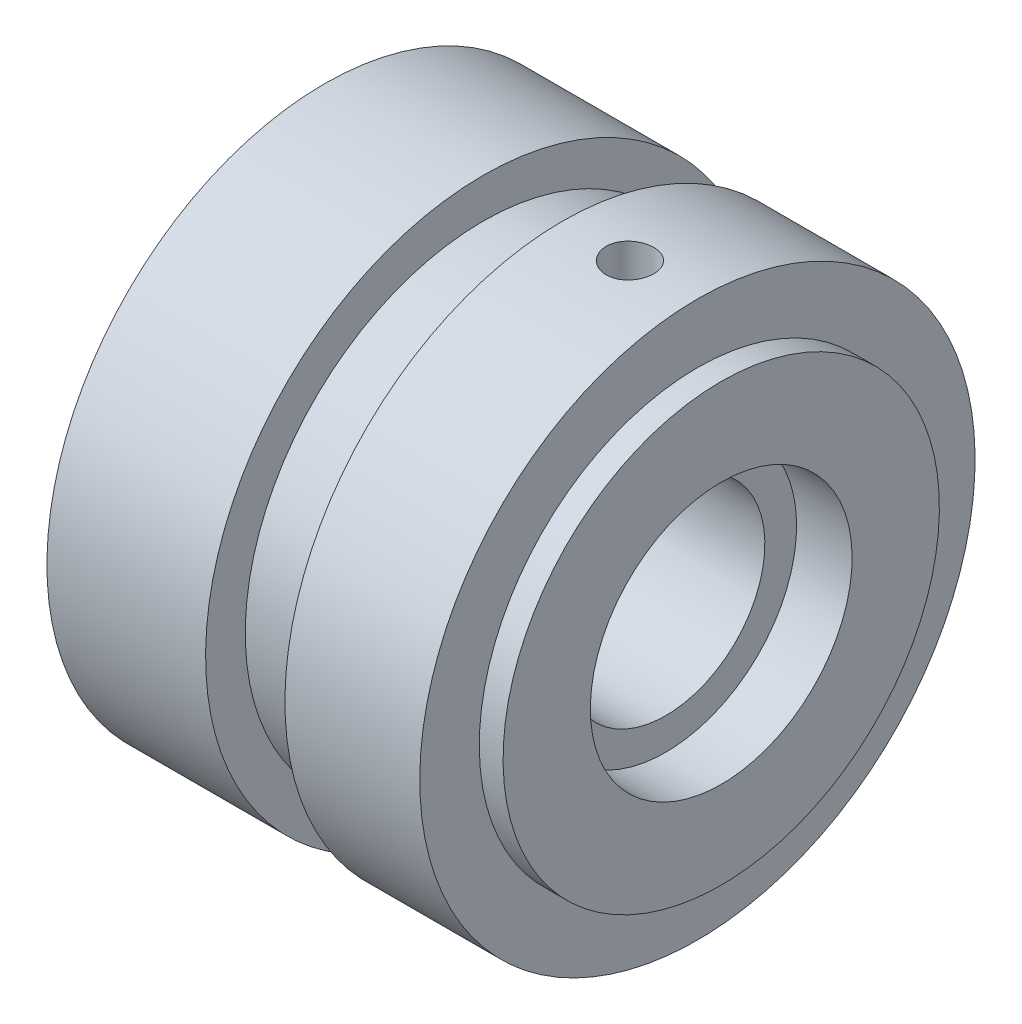
ISO-10303-21;
HEADER;
FILE_DESCRIPTION(('STEP AP214'),'2;1');
FILE_NAME('part.step','',(''),(''),'','','');
FILE_SCHEMA(('AUTOMOTIVE_DESIGN { 1 0 10303 214 1 1 1 1 }'));
ENDSEC;
DATA;
#1=APPLICATION_CONTEXT('core data for automotive mechanical design processes');
#2=APPLICATION_PROTOCOL_DEFINITION('international standard','automotive_design',2000,#1);
#3=PRODUCT_CONTEXT('',#1,'mechanical');
#4=PRODUCT('Part','Part','',(#3));
#5=PRODUCT_RELATED_PRODUCT_CATEGORY('part','',(#4));
#6=PRODUCT_DEFINITION_FORMATION('','',#4);
#7=PRODUCT_DEFINITION_CONTEXT('part definition',#1,'design');
#8=PRODUCT_DEFINITION('design','',#6,#7);
#9=PRODUCT_DEFINITION_SHAPE('','',#8);
#10=(LENGTH_UNIT() NAMED_UNIT(*) SI_UNIT(.MILLI.,.METRE.));
#11=(NAMED_UNIT(*) PLANE_ANGLE_UNIT() SI_UNIT($,.RADIAN.));
#12=(NAMED_UNIT(*) SI_UNIT($,.STERADIAN.) SOLID_ANGLE_UNIT());
#13=UNCERTAINTY_MEASURE_WITH_UNIT(LENGTH_MEASURE(1.E-05),#10,'distance_accuracy_value','');
#14=(GEOMETRIC_REPRESENTATION_CONTEXT(3) GLOBAL_UNCERTAINTY_ASSIGNED_CONTEXT((#13)) GLOBAL_UNIT_ASSIGNED_CONTEXT((#10,
#11,#12)) REPRESENTATION_CONTEXT('',''));
#15=CARTESIAN_POINT('',(0.,0.,0.));
#16=DIRECTION('',(0.,0.,1.));
#17=DIRECTION('',(1.,0.,0.));
#18=AXIS2_PLACEMENT_3D('',#15,#16,#17);
#19=CARTESIAN_POINT('',(25.,0.,0.));
#20=DIRECTION('',(-1.,0.,0.));
#21=DIRECTION('',(0.,-1.,0.));
#22=AXIS2_PLACEMENT_3D('',#19,#20,#21);
#23=PLANE('',#22);
#24=CARTESIAN_POINT('',(25.,0.,0.));
#25=DIRECTION('',(1.,0.,0.));
#26=DIRECTION('',(0.,1.,0.));
#27=AXIS2_PLACEMENT_3D('',#24,#25,#26);
#28=CIRCLE('',#27,16.5);
#29=CARTESIAN_POINT('',(25.,16.5,0.));
#30=VERTEX_POINT('',#29);
#31=EDGE_CURVE('E68',#30,#30,#28,.T.);
#32=ORIENTED_EDGE('',*,*,#31,.F.);
#33=EDGE_LOOP('',(#32));
#34=FACE_BOUND('',#33,.T.);
#35=CARTESIAN_POINT('',(25.,0.,0.));
#36=DIRECTION('',(1.,0.,0.));
#37=DIRECTION('',(0.,1.,0.));
#38=AXIS2_PLACEMENT_3D('',#35,#36,#37);
#39=CIRCLE('',#38,27.5);
#40=CARTESIAN_POINT('',(25.,27.5,0.));
#41=VERTEX_POINT('',#40);
#42=EDGE_CURVE('E80',#41,#41,#39,.T.);
#43=ORIENTED_EDGE('',*,*,#42,.T.);
#44=EDGE_LOOP('',(#43));
#45=FACE_BOUND('',#44,.T.);
#46=ADVANCED_FACE('F36',(#34,#45),#23,.F.);
#47=CARTESIAN_POINT('',(25.,0.,0.));
#48=DIRECTION('',(1.,0.,0.));
#49=DIRECTION('',(0.,1.,0.));
#50=AXIS2_PLACEMENT_3D('',#47,#48,#49);
#51=CYLINDRICAL_SURFACE('',#50,35.);
#52=CARTESIAN_POINT('',(10.5,35.,0.));
#53=CARTESIAN_POINT('',(10.5000073378914,34.9999983189466,-0.168180177421424));
#54=CARTESIAN_POINT('',(10.5141898622868,34.9987748870089,-0.336474410694065));
#55=CARTESIAN_POINT('',(10.5705572337709,34.9940120055983,-0.668405276387217));
#56=CARTESIAN_POINT('',(10.6127736903921,34.9904699418268,-0.832036433522408));
#57=CARTESIAN_POINT('',(10.7239780691511,34.9814700099417,-1.14978580604664));
#58=CARTESIAN_POINT('',(10.7929507084693,34.9760132356579,-1.30390939390644));
#59=CARTESIAN_POINT('',(10.9556819159582,34.9637955952331,-1.5983553572425));
#60=CARTESIAN_POINT('',(11.0494352316325,34.9570350055299,-1.7386806487592));
#61=CARTESIAN_POINT('',(11.2593382889493,34.9429478698077,-2.00196024172095));
#62=CARTESIAN_POINT('',(11.3755408867995,34.9356200130701,-2.12487233650439));
#63=CARTESIAN_POINT('',(11.6269320893559,34.9212352148941,-2.34947428548935));
#64=CARTESIAN_POINT('',(11.7621215333287,34.9141782854488,-2.45116320107853));
#65=CARTESIAN_POINT('',(12.0479057609426,34.9011203668809,-2.63057608789141));
#66=CARTESIAN_POINT('',(12.1985240179993,34.895121025662,-2.7082627988584));
#67=CARTESIAN_POINT('',(12.5107268958224,34.8848727505605,-2.83722803822897));
#68=CARTESIAN_POINT('',(12.6723113127069,34.8806237841455,-2.88850705745045));
#69=CARTESIAN_POINT('',(13.0014356442893,34.8743684880487,-2.96307845769352));
#70=CARTESIAN_POINT('',(13.1689598283876,34.8723566335604,-2.98643979537529));
#71=CARTESIAN_POINT('',(13.5055626843302,34.8707859372111,-3.00472573441206));
#72=CARTESIAN_POINT('',(13.6746413253986,34.8712270468893,-2.99965089755264));
#73=CARTESIAN_POINT('',(14.0090806499075,34.874507414771,-2.96126551313284));
#74=CARTESIAN_POINT('',(14.174450011339,34.8773403039272,-2.9280299536588));
#75=CARTESIAN_POINT('',(14.4972545012445,34.8850750500347,-2.83438308452453));
#76=CARTESIAN_POINT('',(14.6546895482734,34.8899769282191,-2.77397149596722));
#77=CARTESIAN_POINT('',(14.9573951023907,34.9013046627491,-2.62760362876988));
#78=CARTESIAN_POINT('',(15.1026492875407,34.9077325210554,-2.54161375570937));
#79=CARTESIAN_POINT('',(15.3766913761752,34.9213861292491,-2.34655446417304));
#80=CARTESIAN_POINT('',(15.5054789264848,34.9286118962437,-2.23748455081154));
#81=CARTESIAN_POINT('',(15.7433679217639,34.9430754969892,-1.99894091774494));
#82=CARTESIAN_POINT('',(15.8524043816687,34.9503132942366,-1.86940237855328));
#83=CARTESIAN_POINT('',(16.0471934370775,34.9639632077666,-1.59382461581758));
#84=CARTESIAN_POINT('',(16.1329460158122,34.9703753234546,-1.44778538038973));
#85=CARTESIAN_POINT('',(16.2787292518991,34.9816527329005,-1.14330913680171));
#86=CARTESIAN_POINT('',(16.3387569758538,34.9865178502383,-0.984870717201057));
#87=CARTESIAN_POINT('',(16.4313407566549,34.9941511080319,-0.66011322112835));
#88=CARTESIAN_POINT('',(16.4638974167139,34.9969192945321,-0.493794317781497));
#89=CARTESIAN_POINT('',(16.5005333020898,35.0000408811527,-0.158560250833971));
#90=CARTESIAN_POINT('',(16.5047022771383,35.0004018916599,0.0103450366761294));
#91=CARTESIAN_POINT('',(16.4846796442347,34.9986887867208,0.346452104482658));
#92=CARTESIAN_POINT('',(16.4604883163907,34.9966146953254,0.513653901587615));
#93=CARTESIAN_POINT('',(16.3845061776636,34.9902695086844,0.841351421558965));
#94=CARTESIAN_POINT('',(16.332757022837,34.9860017297263,1.00185687270474));
#95=CARTESIAN_POINT('',(16.2031707799344,34.9757485102754,1.31190702245475));
#96=CARTESIAN_POINT('',(16.1253332563206,34.9697630411066,1.46145153801856));
#97=CARTESIAN_POINT('',(15.9455546470553,34.9567262474856,1.74574288167439));
#98=CARTESIAN_POINT('',(15.8435541684732,34.9496723123826,1.88045202960911));
#99=CARTESIAN_POINT('',(15.6184307800755,34.9352996751561,2.13086824169311));
#100=CARTESIAN_POINT('',(15.4953074819638,34.9279809681673,2.24657495644839));
#101=CARTESIAN_POINT('',(15.2310437302609,34.9138810732733,2.45601016602155));
#102=CARTESIAN_POINT('',(15.0898567364377,34.9071013498897,2.54968004901864));
#103=CARTESIAN_POINT('',(14.7937047549781,34.8948680127784,2.71198063229127));
#104=CARTESIAN_POINT('',(14.6387399117443,34.8894143851545,2.78061159495575));
#105=CARTESIAN_POINT('',(14.319637788876,34.8804590783594,2.8907865424564));
#106=CARTESIAN_POINT('',(14.1555129265559,34.8769548240937,2.93236627395851));
#107=CARTESIAN_POINT('',(13.8225799426221,34.872286503041,2.98737479633476));
#108=CARTESIAN_POINT('',(13.6537719168227,34.871122388412,3.0008041627162));
#109=CARTESIAN_POINT('',(13.3168469352097,34.8712668950776,2.99912392353083));
#110=CARTESIAN_POINT('',(13.1487295090711,34.8725675374248,2.98410640669543));
#111=CARTESIAN_POINT('',(12.8174140725518,34.8774780477604,2.92615085557176));
#112=CARTESIAN_POINT('',(12.6542160694463,34.8810879191635,2.88321277999481));
#113=CARTESIAN_POINT('',(12.3373669784261,34.8902080316544,2.7706585792072));
#114=CARTESIAN_POINT('',(12.1837152460136,34.8957181442861,2.70104425727074));
#115=CARTESIAN_POINT('',(11.8902644242026,34.9080181097009,2.53712384137618));
#116=CARTESIAN_POINT('',(11.7504651359735,34.9148079441114,2.4428181018962));
#117=CARTESIAN_POINT('',(11.4882161540604,34.9289284828144,2.23184571903132));
#118=CARTESIAN_POINT('',(11.3658214669831,34.9362607952504,2.11511080731054));
#119=CARTESIAN_POINT('',(11.142311973233,34.9506254222313,1.86271960746937));
#120=CARTESIAN_POINT('',(11.0412023156171,34.9576576638589,1.72705875414518));
#121=CARTESIAN_POINT('',(10.8629891715587,34.9706432183248,1.44039065385252));
#122=CARTESIAN_POINT('',(10.7859327896545,34.9765944046818,1.28935405311577));
#123=CARTESIAN_POINT('',(10.6583732223328,34.9867226680456,0.976537475486434));
#124=CARTESIAN_POINT('',(10.6078395911493,34.9909017781752,0.81477005805675));
#125=CARTESIAN_POINT('',(10.5475945056929,34.9959451685553,0.543377751492647));
#126=CARTESIAN_POINT('',(10.5297703755469,34.9974587860022,0.435496910992701));
#127=CARTESIAN_POINT('',(10.5059707564334,34.999486746251,0.218426750644093));
#128=CARTESIAN_POINT('',(10.4999952338472,35.0000010918883,0.109237434508938));
#129=CARTESIAN_POINT('',(10.5,35.,0.));
#130=B_SPLINE_CURVE_WITH_KNOTS('',3,(#52,#53,#54,#55,#56,#57,#58,#59,#60,#61,#62,#63,#64,#65,
#66,#67,#68,#69,#70,#71,#72,#73,#74,#75,#76,#77,#78,#79,#80,#81,#82,#83,#84,#85,#86,#87,#88,#89,
#90,#91,#92,#93,#94,#95,#96,#97,#98,#99,#100,#101,#102,#103,#104,#105,#106,#107,#108,#109,#110,
#111,#112,#113,#114,#115,#116,#117,#118,#119,#120,#121,#122,#123,#124,#125,#126,#127,#128,#129),
.UNSPECIFIED.,.T.,.F.,(4,2,2,2,2,2,2,2,2,2,2,2,2,2,2,2,2,2,2,2,2,2,2,2,2,2,2,2,2,2,2,2,2,2,2,2,
2,2,4),(0.,0.504141688620747,1.00885278730409,1.51327602436422,2.01759242981481,2.5231110330061,
3.02865198843329,3.53497383147414,4.04128626359051,4.54634550220951,5.05139476290399,
5.55510335902215,6.05881712462464,6.56319540924794,7.06758450992201,7.57360414720596,
8.07962414892788,8.58570183661505,9.09176841150506,9.59623427417641,10.1006951543972,
10.6043956535469,11.1081045622491,11.6130646830275,12.1180340873686,12.6243317573245,
13.1306241215114,13.636246082805,14.1418577070399,14.6458353534655,15.1498137451707,
15.6537580747011,16.1576951698375,16.6631911333163,17.1688092410493,17.6754113983993,
18.1814307424437,18.5088849156758,18.8363381597994),.UNSPECIFIED.);
#131=CARTESIAN_POINT('',(10.5,35.,0.));
#132=VERTEX_POINT('',#131);
#133=EDGE_CURVE('E83',#132,#132,#130,.T.);
#134=ORIENTED_EDGE('',*,*,#133,.T.);
#135=EDGE_LOOP('',(#134));
#136=FACE_BOUND('',#135,.T.);
#137=CARTESIAN_POINT('',(5.,0.,0.));
#138=DIRECTION('',(1.,0.,0.));
#139=DIRECTION('',(0.,1.,0.));
#140=AXIS2_PLACEMENT_3D('',#137,#138,#139);
#141=CIRCLE('',#140,35.);
#142=CARTESIAN_POINT('',(5.,35.,0.));
#143=VERTEX_POINT('',#142);
#144=EDGE_CURVE('E49',#143,#143,#141,.T.);
#145=ORIENTED_EDGE('',*,*,#144,.T.);
#146=EDGE_LOOP('',(#145));
#147=FACE_BOUND('',#146,.T.);
#148=CARTESIAN_POINT('',(22.,0.,0.));
#149=DIRECTION('',(1.,0.,0.));
#150=DIRECTION('',(0.,1.,0.));
#151=AXIS2_PLACEMENT_3D('',#148,#149,#150);
#152=CIRCLE('',#151,35.);
#153=CARTESIAN_POINT('',(22.,35.,0.));
#154=VERTEX_POINT('',#153);
#155=EDGE_CURVE('E76',#154,#154,#152,.T.);
#156=ORIENTED_EDGE('',*,*,#155,.F.);
#157=EDGE_LOOP('',(#156));
#158=FACE_BOUND('',#157,.T.);
#159=ADVANCED_FACE('F91',(#136,#147,#158),#51,.T.);
#160=CARTESIAN_POINT('',(25.,0.,0.));
#161=DIRECTION('',(1.,0.,0.));
#162=DIRECTION('',(0.,1.,0.));
#163=AXIS2_PLACEMENT_3D('',#160,#161,#162);
#164=CYLINDRICAL_SURFACE('',#163,12.5);
#165=CARTESIAN_POINT('',(10.5,12.5,0.));
#166=CARTESIAN_POINT('',(10.5000050240773,12.4999970714968,0.165963929028716));
#167=CARTESIAN_POINT('',(10.5138184102361,12.4966615634859,0.331985420928067));
#168=CARTESIAN_POINT('',(10.5686327395954,12.4836783946932,0.65928429097138));
#169=CARTESIAN_POINT('',(10.6096504279947,12.4740268462166,0.820558683214274));
#170=CARTESIAN_POINT('',(10.7174923345044,12.4494823208195,1.13358839471402));
#171=CARTESIAN_POINT('',(10.7842868898576,12.4345953702841,1.28535442324822));
#172=CARTESIAN_POINT('',(10.9416854364459,12.4011725442513,1.57552517879763));
#173=CARTESIAN_POINT('',(11.0322897680773,12.3826366165873,1.71392971475166));
#174=CARTESIAN_POINT('',(11.2365641783755,12.3435386014785,1.97609263393972));
#175=CARTESIAN_POINT('',(11.3506027810493,12.3229472454311,2.0995595210048));
#176=CARTESIAN_POINT('',(11.5977188690646,12.2822574370147,2.32581080811943));
#177=CARTESIAN_POINT('',(11.730798342041,12.2621590363612,2.42859304624489));
#178=CARTESIAN_POINT('',(12.0144458330175,12.224437969062,2.61189993555015));
#179=CARTESIAN_POINT('',(12.1652265837588,12.2068525815312,2.69210377047565));
#180=CARTESIAN_POINT('',(12.4786198351285,12.1765733412448,2.82591582947332));
#181=CARTESIAN_POINT('',(12.6412306020232,12.1638787734309,2.87952794169564));
#182=CARTESIAN_POINT('',(12.9704765732689,12.1451184675007,2.95765058108663));
#183=CARTESIAN_POINT('',(13.1369811215255,12.1389341034343,2.98268262400616));
#184=CARTESIAN_POINT('',(13.4719323796428,12.1335389605945,3.00455808879087));
#185=CARTESIAN_POINT('',(13.6403787959569,12.1343271412568,3.00140571682399));
#186=CARTESIAN_POINT('',(13.9704759660129,12.1426811387008,2.96741912081942));
#187=CARTESIAN_POINT('',(14.1321945651896,12.1500960921292,2.93720103400494));
#188=CARTESIAN_POINT('',(14.4481973166478,12.1706283738785,2.85092141637188));
#189=CARTESIAN_POINT('',(14.6024809757344,12.1837460799133,2.79485817372027));
#190=CARTESIAN_POINT('',(14.9009129780844,12.2143476734445,2.65794121231782));
#191=CARTESIAN_POINT('',(15.0449524529167,12.2318714325758,2.5768594824696));
#192=CARTESIAN_POINT('',(15.3176045007226,12.2692875046196,2.39236688956383));
#193=CARTESIAN_POINT('',(15.4462145652851,12.2891802016137,2.28895240342647));
#194=CARTESIAN_POINT('',(15.6878935703187,12.329732025739,2.05951493908847));
#195=CARTESIAN_POINT('',(15.8004670990622,12.3503975788014,1.93297064389908));
#196=CARTESIAN_POINT('',(16.0028847197464,12.3896951594929,1.66255592459691));
#197=CARTESIAN_POINT('',(16.0927282202926,12.4083271342049,1.5186850498214));
#198=CARTESIAN_POINT('',(16.2472972206128,12.4415394956922,1.21702847718581));
#199=CARTESIAN_POINT('',(16.3119474562378,12.4561077058019,1.05920278696054));
#200=CARTESIAN_POINT('',(16.4136650790486,12.4794620474154,0.734497606078676));
#201=CARTESIAN_POINT('',(16.4507373176268,12.4882491958651,0.567619713387662));
#202=CARTESIAN_POINT('',(16.495502064652,12.4989027542709,0.233787399651665));
#203=CARTESIAN_POINT('',(16.5038698924616,12.5009282130753,0.0669284805450082));
#204=CARTESIAN_POINT('',(16.4928332331491,12.4982807419474,-0.265804381586629));
#205=CARTESIAN_POINT('',(16.4734310380128,12.4936083648176,-0.431678404764951));
#206=CARTESIAN_POINT('',(16.4079630214836,12.4781916395217,-0.755422580108845));
#207=CARTESIAN_POINT('',(16.3622608904262,12.4675301590363,-0.913370579311301));
#208=CARTESIAN_POINT('',(16.2459018083047,12.4413335015664,-1.21935330013476));
#209=CARTESIAN_POINT('',(16.1752424570219,12.4257978558334,-1.3673870666415));
#210=CARTESIAN_POINT('',(16.0096334064022,12.3911910149582,-1.6520615099557));
#211=CARTESIAN_POINT('',(15.9142992830756,12.3720653178033,-1.78847176740355));
#212=CARTESIAN_POINT('',(15.7025430709866,12.3324936406987,-2.04359904096632));
#213=CARTESIAN_POINT('',(15.5861176439192,12.3120474520734,-2.16231325074336));
#214=CARTESIAN_POINT('',(15.3323591687914,12.2715742142771,-2.38142453789941));
#215=CARTESIAN_POINT('',(15.1946148779179,12.2515669262668,-2.48134974047369));
#216=CARTESIAN_POINT('',(14.9039095721033,12.2147538797452,-2.65666020824081));
#217=CARTESIAN_POINT('',(14.7509492389065,12.1979479778962,-2.7320465722335));
#218=CARTESIAN_POINT('',(14.434987486456,12.1696189519335,-2.85558993518171));
#219=CARTESIAN_POINT('',(14.2720517965788,12.1580647463107,-2.90390754385904));
#220=CARTESIAN_POINT('',(13.9400538149793,12.1415072663683,-2.97238380283978));
#221=CARTESIAN_POINT('',(13.7709927462382,12.1365026916888,-2.9925480427499));
#222=CARTESIAN_POINT('',(13.4363292997194,12.1337046220624,-3.00387066449353));
#223=CARTESIAN_POINT('',(13.2707535036733,12.1357241633848,-2.99578106592265));
#224=CARTESIAN_POINT('',(12.9434002357763,12.1463176460425,-2.95253345626267));
#225=CARTESIAN_POINT('',(12.7816226988886,12.1548914750658,-2.91737590900096));
#226=CARTESIAN_POINT('',(12.4672024474518,12.1775274976748,-2.82138591303537));
#227=CARTESIAN_POINT('',(12.3145177274163,12.191561756094,-2.76068402045611));
#228=CARTESIAN_POINT('',(12.0213955861163,12.2235433612686,-2.61543373580582));
#229=CARTESIAN_POINT('',(11.8809597314136,12.2414912075257,-2.53088229934855));
#230=CARTESIAN_POINT('',(11.6126629998805,12.279819325529,-2.33793007708463));
#231=CARTESIAN_POINT('',(11.4851876769013,12.3002478697533,-2.22900267979018));
#232=CARTESIAN_POINT('',(11.2500800119481,12.3409359831145,-1.99143074773236));
#233=CARTESIAN_POINT('',(11.1424523367898,12.361195511444,-1.86278158874234));
#234=CARTESIAN_POINT('',(10.9483907404453,12.3996570299581,-1.5868829988014));
#235=CARTESIAN_POINT('',(10.862331594558,12.4178200201219,-1.43936414359402));
#236=CARTESIAN_POINT('',(10.7163704672521,12.4496380610582,-1.13153622828567));
#237=CARTESIAN_POINT('',(10.6564486566084,12.4632965272855,-0.97123697369122));
#238=CARTESIAN_POINT('',(10.5739613748622,12.4824059901497,-0.675887025694766));
#239=CARTESIAN_POINT('',(10.5462833842143,12.4889599449579,-0.542312066268421));
#240=CARTESIAN_POINT('',(10.5093012191481,12.4977580149525,-0.272504227478248));
#241=CARTESIAN_POINT('',(10.4999958747745,12.5000024045682,-0.136271517915776));
#242=CARTESIAN_POINT('',(10.5,12.5,0.));
#243=B_SPLINE_CURVE_WITH_KNOTS('',3,(#165,#166,#167,#168,#169,#170,#171,#172,#173,#174,#175,
#176,#177,#178,#179,#180,#181,#182,#183,#184,#185,#186,#187,#188,#189,#190,#191,#192,#193,#194,
#195,#196,#197,#198,#199,#200,#201,#202,#203,#204,#205,#206,#207,#208,#209,#210,#211,#212,#213,
#214,#215,#216,#217,#218,#219,#220,#221,#222,#223,#224,#225,#226,#227,#228,#229,#230,#231,#232,
#233,#234,#235,#236,#237,#238,#239,#240,#241,#242),.UNSPECIFIED.,.T.,.F.,(4,2,2,2,2,2,2,2,2,2,2,
2,2,2,2,2,2,2,2,2,2,2,2,2,2,2,2,2,2,2,2,2,2,2,2,2,2,2,4),(0.,0.497392599366678,
0.995091645758823,1.49221966408501,1.98935478998519,2.49500570148357,3.00070943533306,
3.51327262050848,4.02576083835037,4.5287399535911,5.03164400680465,5.52338274964838,
6.01515406709137,6.5115466752117,7.00801987450002,7.51749958381934,8.0269925475217,
8.53799614678202,9.04890983140414,9.54771776810825,10.0464845383097,10.5385143736981,
11.0305915421211,11.5308523313794,12.031192370573,12.5427824523192,13.0543496229377,
13.5628484119093,14.0712462285018,14.5662165454701,15.0611783809799,15.5536406351284,
16.0461657803878,16.5505844610431,17.0551215958269,17.5678974206351,18.0802835459068,
18.4887142303991,18.897118905514),.UNSPECIFIED.);
#244=CARTESIAN_POINT('',(10.5,12.5,0.));
#245=VERTEX_POINT('',#244);
#246=EDGE_CURVE('E40',#245,#245,#243,.T.);
#247=ORIENTED_EDGE('',*,*,#246,.T.);
#248=EDGE_LOOP('',(#247));
#249=FACE_BOUND('',#248,.T.);
#250=CARTESIAN_POINT('',(-25.,0.,0.));
#251=DIRECTION('',(1.,0.,0.));
#252=DIRECTION('',(0.,1.,0.));
#253=AXIS2_PLACEMENT_3D('',#250,#251,#252);
#254=CIRCLE('',#253,12.5);
#255=CARTESIAN_POINT('',(-25.,12.5,0.));
#256=VERTEX_POINT('',#255);
#257=EDGE_CURVE('E58',#256,#256,#254,.T.);
#258=ORIENTED_EDGE('',*,*,#257,.F.);
#259=EDGE_LOOP('',(#258));
#260=FACE_BOUND('',#259,.T.);
#261=CARTESIAN_POINT('',(18.,0.,0.));
#262=DIRECTION('',(1.,0.,0.));
#263=DIRECTION('',(0.,1.,0.));
#264=AXIS2_PLACEMENT_3D('',#261,#262,#263);
#265=CIRCLE('',#264,12.5);
#266=CARTESIAN_POINT('',(18.,12.5,0.));
#267=VERTEX_POINT('',#266);
#268=EDGE_CURVE('E71',#267,#267,#265,.T.);
#269=ORIENTED_EDGE('',*,*,#268,.T.);
#270=EDGE_LOOP('',(#269));
#271=FACE_BOUND('',#270,.T.);
#272=ADVANCED_FACE('F141',(#249,#260,#271),#164,.F.);
#273=CARTESIAN_POINT('',(5.,0.,0.));
#274=DIRECTION('',(-1.,0.,0.));
#275=DIRECTION('',(0.,-1.,0.));
#276=AXIS2_PLACEMENT_3D('',#273,#274,#275);
#277=PLANE('',#276);
#278=CARTESIAN_POINT('',(5.,0.,0.));
#279=DIRECTION('',(1.,0.,0.));
#280=DIRECTION('',(0.,1.,0.));
#281=AXIS2_PLACEMENT_3D('',#278,#279,#280);
#282=CIRCLE('',#281,30.);
#283=CARTESIAN_POINT('',(5.,30.,0.));
#284=VERTEX_POINT('',#283);
#285=EDGE_CURVE('E10',#284,#284,#282,.T.);
#286=ORIENTED_EDGE('',*,*,#285,.T.);
#287=EDGE_LOOP('',(#286));
#288=FACE_BOUND('',#287,.T.);
#289=ORIENTED_EDGE('',*,*,#144,.F.);
#290=EDGE_LOOP('',(#289));
#291=FACE_BOUND('',#290,.T.);
#292=ADVANCED_FACE('F38',(#288,#291),#277,.T.);
#293=CARTESIAN_POINT('',(25.,0.,0.));
#294=DIRECTION('',(1.,0.,0.));
#295=DIRECTION('',(0.,1.,0.));
#296=AXIS2_PLACEMENT_3D('',#293,#294,#295);
#297=CYLINDRICAL_SURFACE('',#296,30.);
#298=ORIENTED_EDGE('',*,*,#285,.F.);
#299=EDGE_LOOP('',(#298));
#300=FACE_BOUND('',#299,.T.);
#301=CARTESIAN_POINT('',(-5.,0.,0.));
#302=DIRECTION('',(1.,0.,0.));
#303=DIRECTION('',(0.,1.,0.));
#304=AXIS2_PLACEMENT_3D('',#301,#302,#303);
#305=CIRCLE('',#304,30.);
#306=CARTESIAN_POINT('',(-5.,30.,0.));
#307=VERTEX_POINT('',#306);
#308=EDGE_CURVE('E53',#307,#307,#305,.T.);
#309=ORIENTED_EDGE('',*,*,#308,.T.);
#310=EDGE_LOOP('',(#309));
#311=FACE_BOUND('',#310,.T.);
#312=ADVANCED_FACE('F126',(#300,#311),#297,.T.);
#313=CARTESIAN_POINT('',(-5.,0.,0.));
#314=DIRECTION('',(1.,0.,0.));
#315=DIRECTION('',(0.,-1.,0.));
#316=AXIS2_PLACEMENT_3D('',#313,#314,#315);
#317=PLANE('',#316);
#318=ORIENTED_EDGE('',*,*,#308,.F.);
#319=EDGE_LOOP('',(#318));
#320=FACE_BOUND('',#319,.T.);
#321=CARTESIAN_POINT('',(-5.,0.,0.));
#322=DIRECTION('',(1.,0.,0.));
#323=DIRECTION('',(0.,1.,0.));
#324=AXIS2_PLACEMENT_3D('',#321,#322,#323);
#325=CIRCLE('',#324,35.);
#326=CARTESIAN_POINT('',(-5.,35.,0.));
#327=VERTEX_POINT('',#326);
#328=EDGE_CURVE('E64',#327,#327,#325,.T.);
#329=ORIENTED_EDGE('',*,*,#328,.T.);
#330=EDGE_LOOP('',(#329));
#331=FACE_BOUND('',#330,.T.);
#332=ADVANCED_FACE('F123',(#320,#331),#317,.T.);
#333=CARTESIAN_POINT('',(-25.,0.,0.));
#334=DIRECTION('',(1.,0.,0.));
#335=DIRECTION('',(0.,-1.,0.));
#336=AXIS2_PLACEMENT_3D('',#333,#334,#335);
#337=PLANE('',#336);
#338=ORIENTED_EDGE('',*,*,#257,.T.);
#339=EDGE_LOOP('',(#338));
#340=FACE_BOUND('',#339,.T.);
#341=CARTESIAN_POINT('',(-25.,0.,0.));
#342=DIRECTION('',(1.,0.,0.));
#343=DIRECTION('',(0.,1.,0.));
#344=AXIS2_PLACEMENT_3D('',#341,#342,#343);
#345=CIRCLE('',#344,35.);
#346=CARTESIAN_POINT('',(-25.,35.,0.));
#347=VERTEX_POINT('',#346);
#348=EDGE_CURVE('E61',#347,#347,#345,.T.);
#349=ORIENTED_EDGE('',*,*,#348,.F.);
#350=EDGE_LOOP('',(#349));
#351=FACE_BOUND('',#350,.T.);
#352=ADVANCED_FACE('F120',(#340,#351),#337,.F.);
#353=CARTESIAN_POINT('',(-25.,0.,0.));
#354=DIRECTION('',(-1.,0.,0.));
#355=DIRECTION('',(0.,1.,0.));
#356=AXIS2_PLACEMENT_3D('',#353,#354,#355);
#357=CYLINDRICAL_SURFACE('',#356,35.);
#358=ORIENTED_EDGE('',*,*,#348,.T.);
#359=EDGE_LOOP('',(#358));
#360=FACE_BOUND('',#359,.T.);
#361=ORIENTED_EDGE('',*,*,#328,.F.);
#362=EDGE_LOOP('',(#361));
#363=FACE_BOUND('',#362,.T.);
#364=ADVANCED_FACE('F116',(#360,#363),#357,.T.);
#365=CARTESIAN_POINT('',(18.,0.,0.));
#366=DIRECTION('',(1.,0.,0.));
#367=DIRECTION('',(0.,1.,0.));
#368=AXIS2_PLACEMENT_3D('',#365,#366,#367);
#369=CYLINDRICAL_SURFACE('',#368,16.5);
#370=CARTESIAN_POINT('',(18.,0.,0.));
#371=DIRECTION('',(1.,0.,0.));
#372=DIRECTION('',(0.,1.,0.));
#373=AXIS2_PLACEMENT_3D('',#370,#371,#372);
#374=CIRCLE('',#373,16.5);
#375=CARTESIAN_POINT('',(18.,16.5,0.));
#376=VERTEX_POINT('',#375);
#377=EDGE_CURVE('E67',#376,#376,#374,.T.);
#378=ORIENTED_EDGE('',*,*,#377,.F.);
#379=EDGE_LOOP('',(#378));
#380=FACE_BOUND('',#379,.T.);
#381=ORIENTED_EDGE('',*,*,#31,.T.);
#382=EDGE_LOOP('',(#381));
#383=FACE_BOUND('',#382,.T.);
#384=ADVANCED_FACE('F112',(#380,#383),#369,.F.);
#385=CARTESIAN_POINT('',(18.,0.,0.));
#386=DIRECTION('',(1.,0.,0.));
#387=DIRECTION('',(0.,1.,0.));
#388=AXIS2_PLACEMENT_3D('',#385,#386,#387);
#389=PLANE('',#388);
#390=ORIENTED_EDGE('',*,*,#268,.F.);
#391=EDGE_LOOP('',(#390));
#392=FACE_BOUND('',#391,.T.);
#393=ORIENTED_EDGE('',*,*,#377,.T.);
#394=EDGE_LOOP('',(#393));
#395=FACE_BOUND('',#394,.T.);
#396=ADVANCED_FACE('F108',(#392,#395),#389,.T.);
#397=CARTESIAN_POINT('',(22.,0.,0.));
#398=DIRECTION('',(1.,0.,0.));
#399=DIRECTION('',(0.,1.,0.));
#400=AXIS2_PLACEMENT_3D('',#397,#398,#399);
#401=PLANE('',#400);
#402=CARTESIAN_POINT('',(22.,0.,0.));
#403=DIRECTION('',(1.,0.,0.));
#404=DIRECTION('',(0.,1.,0.));
#405=AXIS2_PLACEMENT_3D('',#402,#403,#404);
#406=CIRCLE('',#405,27.5);
#407=CARTESIAN_POINT('',(22.,27.5,0.));
#408=VERTEX_POINT('',#407);
#409=EDGE_CURVE('E79',#408,#408,#406,.T.);
#410=ORIENTED_EDGE('',*,*,#409,.F.);
#411=EDGE_LOOP('',(#410));
#412=FACE_BOUND('',#411,.T.);
#413=ORIENTED_EDGE('',*,*,#155,.T.);
#414=EDGE_LOOP('',(#413));
#415=FACE_BOUND('',#414,.T.);
#416=ADVANCED_FACE('F104',(#412,#415),#401,.T.);
#417=CARTESIAN_POINT('',(22.,0.,0.));
#418=DIRECTION('',(1.,0.,0.));
#419=DIRECTION('',(0.,1.,0.));
#420=AXIS2_PLACEMENT_3D('',#417,#418,#419);
#421=CYLINDRICAL_SURFACE('',#420,27.5);
#422=ORIENTED_EDGE('',*,*,#409,.T.);
#423=EDGE_LOOP('',(#422));
#424=FACE_BOUND('',#423,.T.);
#425=ORIENTED_EDGE('',*,*,#42,.F.);
#426=EDGE_LOOP('',(#425));
#427=FACE_BOUND('',#426,.T.);
#428=ADVANCED_FACE('F99',(#424,#427),#421,.T.);
#429=CARTESIAN_POINT('',(13.5,10.,0.));
#430=DIRECTION('',(0.,1.,0.));
#431=DIRECTION('',(0.,0.,1.));
#432=AXIS2_PLACEMENT_3D('',#429,#430,#431);
#433=CYLINDRICAL_SURFACE('',#432,3.);
#434=ORIENTED_EDGE('',*,*,#246,.F.);
#435=EDGE_LOOP('',(#434));
#436=FACE_BOUND('',#435,.T.);
#437=ORIENTED_EDGE('',*,*,#133,.F.);
#438=EDGE_LOOP('',(#437));
#439=FACE_BOUND('',#438,.T.);
#440=ADVANCED_FACE('F95',(#436,#439),#433,.F.);
#441=CLOSED_SHELL('',(#46,#159,#272,#292,#312,#332,#352,#364,#384,#396,#416,#428,#440));
#442=MANIFOLD_SOLID_BREP('B2',#441);
#443=ADVANCED_BREP_SHAPE_REPRESENTATION('',(#18,#442),#14);
#444=SHAPE_DEFINITION_REPRESENTATION(#9,#443);
ENDSEC;
END-ISO-10303-21;
